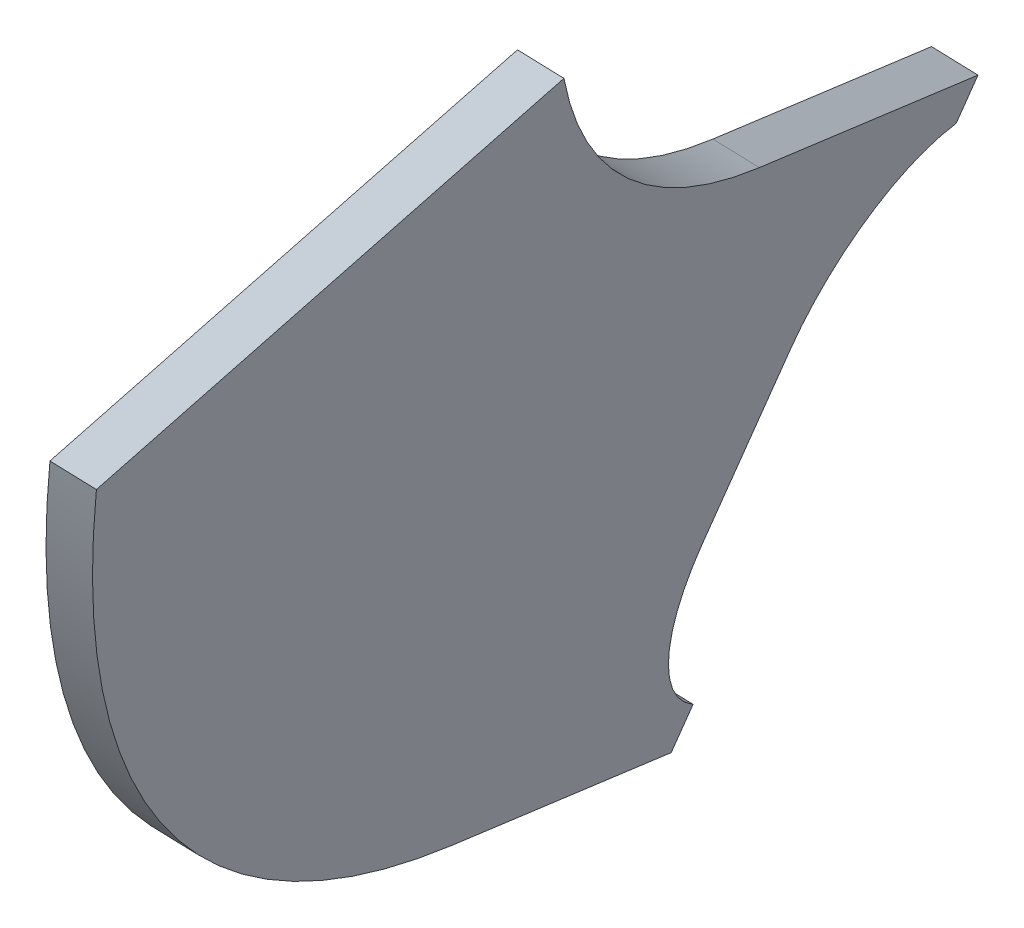
ISO-10303-21;
HEADER;
FILE_DESCRIPTION(('STEP AP214'),'2;1');
FILE_NAME('part.step','',(''),(''),'','','');
FILE_SCHEMA(('AUTOMOTIVE_DESIGN { 1 0 10303 214 1 1 1 1 }'));
ENDSEC;
DATA;
#1=APPLICATION_CONTEXT('core data for automotive mechanical design processes');
#2=APPLICATION_PROTOCOL_DEFINITION('international standard','automotive_design',2000,#1);
#3=PRODUCT_CONTEXT('',#1,'mechanical');
#4=PRODUCT('Part','Part','',(#3));
#5=PRODUCT_RELATED_PRODUCT_CATEGORY('part','',(#4));
#6=PRODUCT_DEFINITION_FORMATION('','',#4);
#7=PRODUCT_DEFINITION_CONTEXT('part definition',#1,'design');
#8=PRODUCT_DEFINITION('design','',#6,#7);
#9=PRODUCT_DEFINITION_SHAPE('','',#8);
#10=(LENGTH_UNIT() NAMED_UNIT(*) SI_UNIT(.MILLI.,.METRE.));
#11=(NAMED_UNIT(*) PLANE_ANGLE_UNIT() SI_UNIT($,.RADIAN.));
#12=(NAMED_UNIT(*) SI_UNIT($,.STERADIAN.) SOLID_ANGLE_UNIT());
#13=UNCERTAINTY_MEASURE_WITH_UNIT(LENGTH_MEASURE(1.E-05),#10,'distance_accuracy_value','');
#14=(GEOMETRIC_REPRESENTATION_CONTEXT(3) GLOBAL_UNCERTAINTY_ASSIGNED_CONTEXT((#13)) GLOBAL_UNIT_ASSIGNED_CONTEXT((#10,
#11,#12)) REPRESENTATION_CONTEXT('',''));
#15=CARTESIAN_POINT('',(0.,0.,0.));
#16=DIRECTION('',(0.,0.,1.));
#17=DIRECTION('',(1.,0.,0.));
#18=AXIS2_PLACEMENT_3D('',#15,#16,#17);
#19=CARTESIAN_POINT('',(136.013526734409,-30.5733150675319,-29.362970095919));
#20=DIRECTION('',(0.951906763192074,-0.234327542076604,-0.197393305898468));
#21=DIRECTION('',(0.239030618578274,0.971012030503272,0.));
#22=AXIS2_PLACEMENT_3D('',#19,#20,#21);
#23=PLANE('',#22);
#24=DIRECTION('',(0.203046588965466,0.,0.979169077692657));
#25=VECTOR('',#24,1.);
#26=CARTESIAN_POINT('',(156.657396436309,-1.55545232769917,35.7423518756556));
#27=LINE('',#26,#25);
#28=CARTESIAN_POINT('',(156.657396436309,-1.55545232769917,35.7423518756556));
#29=VERTEX_POINT('',#28);
#30=CARTESIAN_POINT('',(161.497078933989,-1.55545232769911,59.081170181951));
#31=VERTEX_POINT('',#30);
#32=EDGE_CURVE('E289',#29,#31,#27,.T.);
#33=ORIENTED_EDGE('',*,*,#32,.T.);
#34=CARTESIAN_POINT('',(154.514901911926,10.8871476740857,10.6396824575147));
#35=DIRECTION('',(0.951906763192074,-0.234327542076604,-0.197393305898468));
#36=DIRECTION('',(0.239030618578274,0.971012030503272,0.));
#37=AXIS2_PLACEMENT_3D('',#34,#35,#36);
#38=CIRCLE('',#37,50.4989784424255);
#39=CARTESIAN_POINT('',(147.486802486778,-34.7970004192457,30.9795756525478));
#40=VERTEX_POINT('',#39);
#41=EDGE_CURVE('E265',#31,#40,#38,.T.);
#42=ORIENTED_EDGE('',*,*,#41,.T.);
#43=DIRECTION('',(-0.272954872017977,-0.355935558889325,-0.893759204573465));
#44=VECTOR('',#43,1.);
#45=CARTESIAN_POINT('',(147.486802486778,-34.7970004192457,30.9795756525478));
#46=LINE('',#45,#44);
#47=CARTESIAN_POINT('',(143.68295651287,-39.7572490956746,18.5243213212148));
#48=VERTEX_POINT('',#47);
#49=EDGE_CURVE('E268',#40,#48,#46,.T.);
#50=ORIENTED_EDGE('',*,*,#49,.T.);
#51=DIRECTION('',(0.139173100960053,0.904654896047375,-0.4027783100251));
#52=VECTOR('',#51,1.);
#53=CARTESIAN_POINT('',(143.68295651287,-39.7572490956746,18.5243213212148));
#54=LINE('',#53,#52);
#55=CARTESIAN_POINT('',(143.905198664594,-38.3126276186889,17.881134400248));
#56=VERTEX_POINT('',#55);
#57=EDGE_CURVE('E173',#48,#56,#54,.T.);
#58=ORIENTED_EDGE('',*,*,#57,.T.);
#59=CARTESIAN_POINT('',(144.359613525321,-33.0895068215186,13.8720801136964));
#60=DIRECTION('',(-0.951906763192074,0.234327542076604,0.197393305898468));
#61=DIRECTION('',(0.239030618578274,0.971012030503272,0.));
#62=AXIS2_PLACEMENT_3D('',#59,#60,#61);
#63=CIRCLE('',#62,6.6);
#64=CARTESIAN_POINT('',(146.16111568064,-30.740332132849,19.7708908638813));
#65=VERTEX_POINT('',#64);
#66=EDGE_CURVE('E271',#56,#65,#63,.T.);
#67=ORIENTED_EDGE('',*,*,#66,.T.);
#68=DIRECTION('',(0.139173100960057,0.904654896047373,-0.402778310025105));
#69=VECTOR('',#68,1.);
#70=CARTESIAN_POINT('',(146.16111568064,-30.740332132849,19.7708908638813));
#71=LINE('',#70,#69);
#72=CARTESIAN_POINT('',(147.051823526784,-24.9505407981458,17.1931096797206));
#73=VERTEX_POINT('',#72);
#74=EDGE_CURVE('E274',#65,#73,#71,.T.);
#75=ORIENTED_EDGE('',*,*,#74,.T.);
#76=CARTESIAN_POINT('',(145.250321371466,-27.2997154868154,11.2942989295358));
#77=DIRECTION('',(-0.951906763192074,0.234327542076604,0.197393305898468));
#78=DIRECTION('',(0.239030618578274,0.971012030503272,0.));
#79=AXIS2_PLACEMENT_3D('',#76,#77,#78);
#80=CIRCLE('',#79,6.59999999999999);
#81=CARTESIAN_POINT('',(146.578191822651,-20.9376009011992,10.1452740976194));
#82=VERTEX_POINT('',#81);
#83=EDGE_CURVE('E277',#73,#82,#80,.T.);
#84=ORIENTED_EDGE('',*,*,#83,.T.);
#85=DIRECTION('',(0.139173100960054,0.904654896047374,-0.402778310025103));
#86=VECTOR('',#85,1.);
#87=CARTESIAN_POINT('',(146.578191822651,-20.9376009011992,10.1452740976194));
#88=LINE('',#87,#86);
#89=CARTESIAN_POINT('',(146.800433974375,-19.4929794242134,9.50208717665252));
#90=VERTEX_POINT('',#89);
#91=EDGE_CURVE('E280',#82,#90,#88,.T.);
#92=ORIENTED_EDGE('',*,*,#91,.T.);
#93=DIRECTION('',(0.272954872017978,0.355935558889322,0.893759204573466));
#94=VECTOR('',#93,1.);
#95=CARTESIAN_POINT('',(146.800433974375,-19.4929794242134,9.50208717665252));
#96=LINE('',#95,#94);
#97=CARTESIAN_POINT('',(150.604279948284,-14.5327307477841,21.9573415079867));
#98=VERTEX_POINT('',#97);
#99=EDGE_CURVE('E283',#90,#98,#96,.T.);
#100=ORIENTED_EDGE('',*,*,#99,.T.);
#101=CARTESIAN_POINT('',(154.514901911926,10.8871476740857,10.6396824575147));
#102=DIRECTION('',(-0.951906763192074,0.234327542076604,0.197393305898468));
#103=DIRECTION('',(0.239030618578274,0.971012030503272,0.));
#104=AXIS2_PLACEMENT_3D('',#101,#102,#103);
#105=CIRCLE('',#104,28.0989784424255);
#106=EDGE_CURVE('E286',#98,#29,#105,.T.);
#107=ORIENTED_EDGE('',*,*,#106,.T.);
#108=EDGE_LOOP('',(#33,#42,#50,#58,#67,#75,#84,#92,#100,#107));
#109=FACE_BOUND('',#108,.T.);
#110=ADVANCED_FACE('F151',(#109),#23,.T.);
#111=CARTESIAN_POINT('',(135.640887487671,15.5332974653985,14.5535154575933));
#112=DIRECTION('',(0.951906763192074,-0.234327542076604,-0.197393305898468));
#113=DIRECTION('',(0.239030618578274,0.971012030503272,0.));
#114=AXIS2_PLACEMENT_3D('',#111,#112,#113);
#115=CYLINDRICAL_SURFACE('',#114,50.4989784424255);
#116=CARTESIAN_POINT('',(152.991851090816,11.2620717414089,10.9555117469529));
#117=DIRECTION('',(-0.951906763192123,0.23432754207654,0.197393305898306));
#118=DIRECTION('',(-0.239030618578201,-0.97101203050329,0.));
#119=AXIS2_PLACEMENT_3D('',#116,#117,#118);
#120=CIRCLE('',#119,50.4989784424255);
#121=CARTESIAN_POINT('',(159.974028112872,-1.18052826037412,59.3969994713906));
#122=VERTEX_POINT('',#121);
#123=CARTESIAN_POINT('',(145.963751665668,-34.4220763519225,31.295404941986));
#124=VERTEX_POINT('',#123);
#125=EDGE_CURVE('E165',#122,#124,#120,.F.);
#126=ORIENTED_EDGE('',*,*,#125,.T.);
#127=DIRECTION('',(0.951906763192074,-0.234327542076604,-0.197393305898468));
#128=VECTOR('',#127,1.);
#129=CARTESIAN_POINT('',(128.612788062523,-30.1508506279329,34.8934086526264));
#130=LINE('',#129,#128);
#131=EDGE_CURVE('E234',#124,#40,#130,.T.);
#132=ORIENTED_EDGE('',*,*,#131,.T.);
#133=ORIENTED_EDGE('',*,*,#41,.F.);
#134=DIRECTION('',(0.951906763192074,-0.234327542076604,-0.197393305898468));
#135=VECTOR('',#134,1.);
#136=CARTESIAN_POINT('',(142.623064509733,3.09069746361371,62.9950031820296));
#137=LINE('',#136,#135);
#138=EDGE_CURVE('E158',#122,#31,#137,.T.);
#139=ORIENTED_EDGE('',*,*,#138,.F.);
#140=EDGE_LOOP('',(#126,#132,#133,#139));
#141=FACE_BOUND('',#140,.T.);
#142=ADVANCED_FACE('F306',(#141),#115,.T.);
#143=CARTESIAN_POINT('',(137.783382012054,3.09069746361365,39.6561848757341));
#144=DIRECTION('',(0.229446283253135,0.972157704811487,-0.0475794081193186));
#145=DIRECTION('',(-0.973259961975826,0.229706435292557,0.));
#146=AXIS2_PLACEMENT_3D('',#143,#144,#145);
#147=PLANE('',#146);
#148=DIRECTION('',(0.203046588965306,0.,0.979169077692691));
#149=VECTOR('',#148,1.);
#150=CARTESIAN_POINT('',(155.134345615197,-1.18052826037512,36.0581811650974));
#151=LINE('',#150,#149);
#152=CARTESIAN_POINT('',(155.134345615196,-1.18052826037512,36.0581811650944));
#153=VERTEX_POINT('',#152);
#154=EDGE_CURVE('E261',#153,#122,#151,.T.);
#155=ORIENTED_EDGE('',*,*,#154,.T.);
#156=ORIENTED_EDGE('',*,*,#138,.T.);
#157=ORIENTED_EDGE('',*,*,#32,.F.);
#158=DIRECTION('',(0.951906763192074,-0.234327542076604,-0.197393305898468));
#159=VECTOR('',#158,1.);
#160=CARTESIAN_POINT('',(137.783382012054,3.09069746361365,39.6561848757341));
#161=LINE('',#160,#159);
#162=EDGE_CURVE('E293',#153,#29,#161,.T.);
#163=ORIENTED_EDGE('',*,*,#162,.F.);
#164=EDGE_LOOP('',(#155,#156,#157,#163));
#165=FACE_BOUND('',#164,.T.);
#166=ADVANCED_FACE('F311',(#165),#147,.T.);
#167=CARTESIAN_POINT('',(135.640887487671,15.5332974653985,14.5535154575933));
#168=DIRECTION('',(0.951906763192074,-0.234327542076604,-0.197393305898468));
#169=DIRECTION('',(0.239030618578274,0.971012030503272,0.));
#170=AXIS2_PLACEMENT_3D('',#167,#168,#169);
#171=CYLINDRICAL_SURFACE('',#170,28.0989784424255);
#172=CARTESIAN_POINT('',(152.991851090816,11.2620717414089,10.9555117469529));
#173=DIRECTION('',(-0.951906763192123,0.23432754207654,0.197393305898306));
#174=DIRECTION('',(-0.239030618578201,-0.97101203050329,0.));
#175=AXIS2_PLACEMENT_3D('',#172,#173,#174);
#176=CIRCLE('',#175,28.0989784424255);
#177=CARTESIAN_POINT('',(149.081229127174,-14.1578066804608,22.2731707974248));
#178=VERTEX_POINT('',#177);
#179=EDGE_CURVE('E258',#178,#153,#176,.T.);
#180=ORIENTED_EDGE('',*,*,#179,.T.);
#181=ORIENTED_EDGE('',*,*,#162,.T.);
#182=ORIENTED_EDGE('',*,*,#106,.F.);
#183=DIRECTION('',(0.951906763192074,-0.234327542076604,-0.197393305898468));
#184=VECTOR('',#183,1.);
#185=CARTESIAN_POINT('',(131.730265524028,-9.88658095647129,25.8711745080653));
#186=LINE('',#185,#184);
#187=EDGE_CURVE('E295',#178,#98,#186,.T.);
#188=ORIENTED_EDGE('',*,*,#187,.F.);
#189=EDGE_LOOP('',(#180,#181,#182,#188));
#190=FACE_BOUND('',#189,.T.);
#191=ADVANCED_FACE('F317',(#190),#171,.F.);
#192=CARTESIAN_POINT('',(127.92641955012,-14.8468296329006,13.4159201767311));
#193=DIRECTION('',(0.139173100960059,0.904654896047373,-0.402778310025104));
#194=DIRECTION('',(0.,0.406736643075801,0.9135454576426));
#195=AXIS2_PLACEMENT_3D('',#192,#193,#194);
#196=PLANE('',#195);
#197=DIRECTION('',(0.272954872017804,0.355935558889365,0.893759204573502));
#198=VECTOR('',#197,1.);
#199=CARTESIAN_POINT('',(145.277383153268,-19.1180553568896,9.8179164660931));
#200=LINE('',#199,#198);
#201=CARTESIAN_POINT('',(145.277383153267,-19.1180553568908,9.81791646609015));
#202=VERTEX_POINT('',#201);
#203=EDGE_CURVE('E255',#202,#178,#200,.T.);
#204=ORIENTED_EDGE('',*,*,#203,.T.);
#205=ORIENTED_EDGE('',*,*,#187,.T.);
#206=ORIENTED_EDGE('',*,*,#99,.F.);
#207=DIRECTION('',(0.951906763192074,-0.234327542076604,-0.197393305898468));
#208=VECTOR('',#207,1.);
#209=CARTESIAN_POINT('',(127.92641955012,-14.8468296329006,13.4159201767311));
#210=LINE('',#209,#208);
#211=EDGE_CURVE('E297',#202,#90,#210,.T.);
#212=ORIENTED_EDGE('',*,*,#211,.F.);
#213=EDGE_LOOP('',(#204,#205,#206,#212));
#214=FACE_BOUND('',#213,.T.);
#215=ADVANCED_FACE('F320',(#214),#196,.T.);
#216=CARTESIAN_POINT('',(127.704177398395,-16.2914511098864,14.0591070976979));
#217=DIRECTION('',(-0.272954872017977,-0.355935558889323,-0.893759204573466));
#218=DIRECTION('',(0.,0.929037703397894,-0.369985061408115));
#219=AXIS2_PLACEMENT_3D('',#216,#217,#218);
#220=PLANE('',#219);
#221=DIRECTION('',(0.139173100960059,0.904654896047373,-0.402778310025104));
#222=VECTOR('',#221,1.);
#223=CARTESIAN_POINT('',(145.055141001543,-20.5626768338765,10.461103387057));
#224=LINE('',#223,#222);
#225=CARTESIAN_POINT('',(145.055141001543,-20.5626768338765,10.461103387057));
#226=VERTEX_POINT('',#225);
#227=EDGE_CURVE('E252',#226,#202,#224,.T.);
#228=ORIENTED_EDGE('',*,*,#227,.T.);
#229=ORIENTED_EDGE('',*,*,#211,.T.);
#230=ORIENTED_EDGE('',*,*,#91,.F.);
#231=DIRECTION('',(0.951906763192074,-0.234327542076604,-0.197393305898468));
#232=VECTOR('',#231,1.);
#233=CARTESIAN_POINT('',(127.704177398395,-16.2914511098864,14.0591070976979));
#234=LINE('',#233,#232);
#235=EDGE_CURVE('E299',#226,#82,#234,.T.);
#236=ORIENTED_EDGE('',*,*,#235,.F.);
#237=EDGE_LOOP('',(#228,#229,#230,#236));
#238=FACE_BOUND('',#237,.T.);
#239=ADVANCED_FACE('F323',(#238),#220,.T.);
#240=CARTESIAN_POINT('',(126.37630694721,-22.6535656955025,15.2081319296143));
#241=DIRECTION('',(0.951906763192074,-0.234327542076604,-0.197393305898468));
#242=DIRECTION('',(0.239030618578274,0.971012030503272,0.));
#243=AXIS2_PLACEMENT_3D('',#240,#241,#242);
#244=CYLINDRICAL_SURFACE('',#243,6.59999999999999);
#245=CARTESIAN_POINT('',(143.727270550358,-26.9247914194927,11.6101282189734));
#246=DIRECTION('',(-0.951906763192123,0.23432754207654,0.197393305898306));
#247=DIRECTION('',(-0.239030618578201,-0.97101203050329,0.));
#248=AXIS2_PLACEMENT_3D('',#245,#246,#247);
#249=CIRCLE('',#248,6.59999999999999);
#250=CARTESIAN_POINT('',(145.528772705676,-24.5756167308229,17.5089389691585));
#251=VERTEX_POINT('',#250);
#252=EDGE_CURVE('E249',#251,#226,#249,.T.);
#253=ORIENTED_EDGE('',*,*,#252,.T.);
#254=ORIENTED_EDGE('',*,*,#235,.T.);
#255=ORIENTED_EDGE('',*,*,#83,.F.);
#256=DIRECTION('',(0.951906763192074,-0.234327542076604,-0.197393305898468));
#257=VECTOR('',#256,1.);
#258=CARTESIAN_POINT('',(128.177809102529,-20.304391006833,21.1069426797992));
#259=LINE('',#258,#257);
#260=EDGE_CURVE('E301',#251,#73,#259,.T.);
#261=ORIENTED_EDGE('',*,*,#260,.F.);
#262=EDGE_LOOP('',(#253,#254,#255,#261));
#263=FACE_BOUND('',#262,.T.);
#264=ADVANCED_FACE('F326',(#263),#244,.F.);
#265=CARTESIAN_POINT('',(127.287101256385,-26.0941823415362,23.6847238639599));
#266=DIRECTION('',(-0.272954872017977,-0.355935558889324,-0.893759204573466));
#267=DIRECTION('',(0.,0.929037703397893,-0.369985061408117));
#268=AXIS2_PLACEMENT_3D('',#265,#266,#267);
#269=PLANE('',#268);
#270=DIRECTION('',(0.139173100960059,0.904654896047372,-0.402778310025105));
#271=VECTOR('',#270,1.);
#272=CARTESIAN_POINT('',(144.638064859531,-30.3654080655261,20.0867201533191));
#273=LINE('',#272,#271);
#274=CARTESIAN_POINT('',(144.638064859531,-30.3654080655261,20.0867201533191));
#275=VERTEX_POINT('',#274);
#276=EDGE_CURVE('E244',#275,#251,#273,.T.);
#277=ORIENTED_EDGE('',*,*,#276,.T.);
#278=ORIENTED_EDGE('',*,*,#260,.T.);
#279=ORIENTED_EDGE('',*,*,#74,.F.);
#280=DIRECTION('',(0.951906763192074,-0.234327542076604,-0.197393305898468));
#281=VECTOR('',#280,1.);
#282=CARTESIAN_POINT('',(127.287101256385,-26.0941823415362,23.6847238639599));
#283=LINE('',#282,#281);
#284=EDGE_CURVE('E303',#275,#65,#283,.T.);
#285=ORIENTED_EDGE('',*,*,#284,.F.);
#286=EDGE_LOOP('',(#277,#278,#279,#285));
#287=FACE_BOUND('',#286,.T.);
#288=ADVANCED_FACE('F330',(#287),#269,.T.);
#289=CARTESIAN_POINT('',(125.485599101066,-28.4433570302057,17.785913113775));
#290=DIRECTION('',(0.951906763192074,-0.234327542076604,-0.197393305898468));
#291=DIRECTION('',(0.239030618578274,0.971012030503272,0.));
#292=AXIS2_PLACEMENT_3D('',#289,#290,#291);
#293=CYLINDRICAL_SURFACE('',#292,6.6);
#294=CARTESIAN_POINT('',(142.836562704214,-32.714582754196,14.187909403134));
#295=DIRECTION('',(-0.951906763192123,0.23432754207654,0.197393305898306));
#296=DIRECTION('',(-0.239030618578201,-0.97101203050329,0.));
#297=AXIS2_PLACEMENT_3D('',#294,#295,#296);
#298=CIRCLE('',#297,6.6);
#299=CARTESIAN_POINT('',(142.382147843486,-37.9377035513662,18.1969636896856));
#300=VERTEX_POINT('',#299);
#301=EDGE_CURVE('E242',#300,#275,#298,.T.);
#302=ORIENTED_EDGE('',*,*,#301,.T.);
#303=ORIENTED_EDGE('',*,*,#284,.T.);
#304=ORIENTED_EDGE('',*,*,#66,.F.);
#305=DIRECTION('',(0.951906763192074,-0.234327542076604,-0.197393305898468));
#306=VECTOR('',#305,1.);
#307=CARTESIAN_POINT('',(125.031184240339,-33.666477827376,21.7949674003266));
#308=LINE('',#307,#306);
#309=EDGE_CURVE('E233',#300,#56,#308,.T.);
#310=ORIENTED_EDGE('',*,*,#309,.F.);
#311=EDGE_LOOP('',(#302,#303,#304,#310));
#312=FACE_BOUND('',#311,.T.);
#313=ADVANCED_FACE('F333',(#312),#293,.F.);
#314=CARTESIAN_POINT('',(124.808942088614,-35.1110993043618,22.4381543212934));
#315=DIRECTION('',(-0.272954872017976,-0.355935558889321,-0.893759204573467));
#316=DIRECTION('',(0.,0.929037703397895,-0.369985061408113));
#317=AXIS2_PLACEMENT_3D('',#314,#315,#316);
#318=PLANE('',#317);
#319=DIRECTION('',(0.13917310096006,0.904654896047374,-0.402778310025102));
#320=VECTOR('',#319,1.);
#321=CARTESIAN_POINT('',(142.159905691762,-39.382325028352,18.8401506106525));
#322=LINE('',#321,#320);
#323=CARTESIAN_POINT('',(142.159905691762,-39.382325028352,18.8401506106525));
#324=VERTEX_POINT('',#323);
#325=EDGE_CURVE('E228',#324,#300,#322,.T.);
#326=ORIENTED_EDGE('',*,*,#325,.T.);
#327=ORIENTED_EDGE('',*,*,#309,.T.);
#328=ORIENTED_EDGE('',*,*,#57,.F.);
#329=DIRECTION('',(0.951906763192074,-0.234327542076604,-0.197393305898468));
#330=VECTOR('',#329,1.);
#331=CARTESIAN_POINT('',(124.808942088614,-35.1110993043618,22.4381543212934));
#332=LINE('',#331,#330);
#333=EDGE_CURVE('E225',#324,#48,#332,.T.);
#334=ORIENTED_EDGE('',*,*,#333,.F.);
#335=EDGE_LOOP('',(#326,#327,#328,#334));
#336=FACE_BOUND('',#335,.T.);
#337=ADVANCED_FACE('F226',(#336),#318,.T.);
#338=CARTESIAN_POINT('',(128.612788062523,-30.1508506279329,34.8934086526264));
#339=DIRECTION('',(-0.139173100960058,-0.904654896047372,0.402778310025106));
#340=DIRECTION('',(0.,-0.406736643075804,-0.913545457642599));
#341=AXIS2_PLACEMENT_3D('',#338,#339,#340);
#342=PLANE('',#341);
#343=DIRECTION('',(-0.272954872017805,-0.355935558889368,-0.893759204573501));
#344=VECTOR('',#343,1.);
#345=CARTESIAN_POINT('',(145.963751665669,-34.4220763519213,31.2954049419889));
#346=LINE('',#345,#344);
#347=EDGE_CURVE('E13',#124,#324,#346,.T.);
#348=ORIENTED_EDGE('',*,*,#347,.T.);
#349=ORIENTED_EDGE('',*,*,#333,.T.);
#350=ORIENTED_EDGE('',*,*,#49,.F.);
#351=ORIENTED_EDGE('',*,*,#131,.F.);
#352=EDGE_LOOP('',(#348,#349,#350,#351));
#353=FACE_BOUND('',#352,.T.);
#354=ADVANCED_FACE('F237',(#353),#342,.T.);
#355=CARTESIAN_POINT('',(134.490475913316,-30.1983910002019,-29.0471408064601));
#356=DIRECTION('',(-0.951906763192123,0.23432754207654,0.197393305898306));
#357=DIRECTION('',(-0.239030618578201,-0.97101203050329,0.));
#358=AXIS2_PLACEMENT_3D('',#355,#356,#357);
#359=PLANE('',#358);
#360=ORIENTED_EDGE('',*,*,#347,.F.);
#361=ORIENTED_EDGE('',*,*,#125,.F.);
#362=ORIENTED_EDGE('',*,*,#154,.F.);
#363=ORIENTED_EDGE('',*,*,#179,.F.);
#364=ORIENTED_EDGE('',*,*,#203,.F.);
#365=ORIENTED_EDGE('',*,*,#227,.F.);
#366=ORIENTED_EDGE('',*,*,#252,.F.);
#367=ORIENTED_EDGE('',*,*,#276,.F.);
#368=ORIENTED_EDGE('',*,*,#301,.F.);
#369=ORIENTED_EDGE('',*,*,#325,.F.);
#370=EDGE_LOOP('',(#360,#361,#362,#363,#364,#365,#366,#367,#368,#369));
#371=FACE_BOUND('',#370,.T.);
#372=ADVANCED_FACE('F239',(#371),#359,.T.);
#373=CLOSED_SHELL('',(#110,#142,#166,#191,#215,#239,#264,#288,#313,#337,#354,#372));
#374=MANIFOLD_SOLID_BREP('B2',#373);
#375=ADVANCED_BREP_SHAPE_REPRESENTATION('',(#18,#374),#14);
#376=SHAPE_DEFINITION_REPRESENTATION(#9,#375);
ENDSEC;
END-ISO-10303-21;
